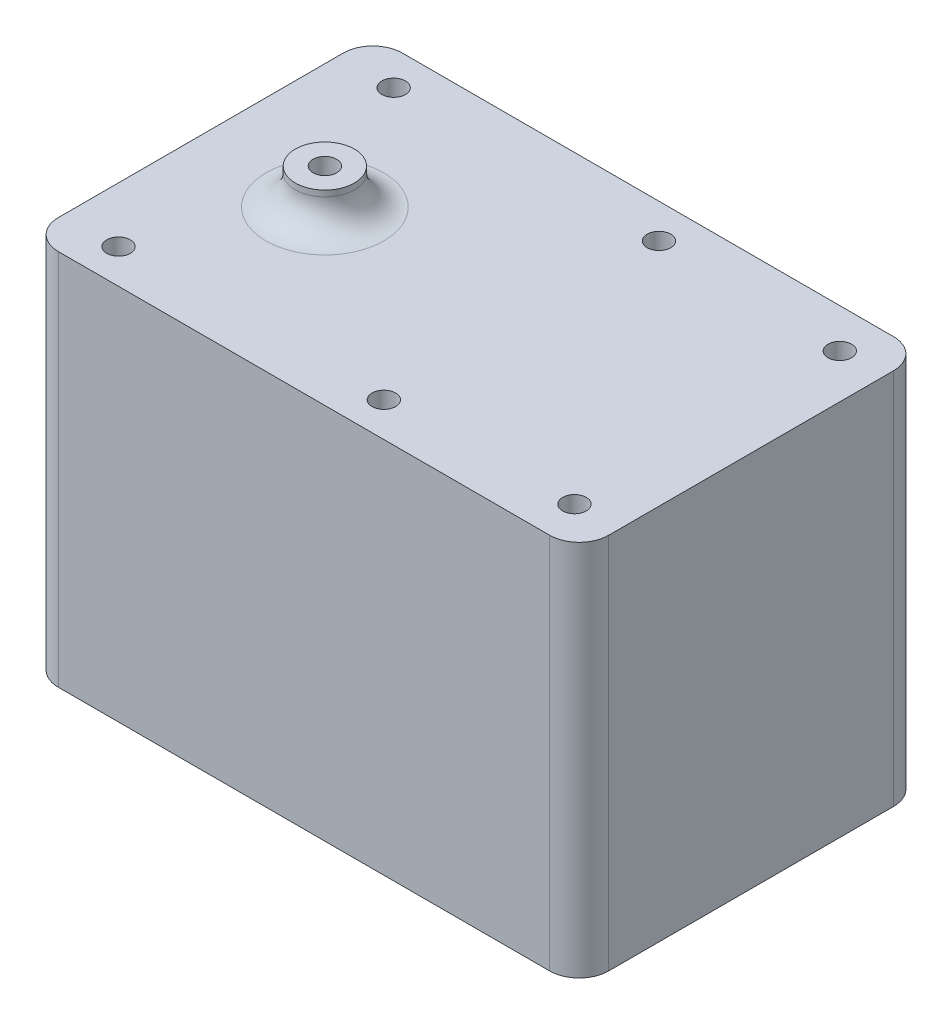
ISO-10303-21;
HEADER;
FILE_DESCRIPTION(('STEP AP214'),'2;1');
FILE_NAME('part.step','',(''),(''),'','','');
FILE_SCHEMA(('AUTOMOTIVE_DESIGN { 1 0 10303 214 1 1 1 1 }'));
ENDSEC;
DATA;
#1=APPLICATION_CONTEXT('core data for automotive mechanical design processes');
#2=APPLICATION_PROTOCOL_DEFINITION('international standard','automotive_design',2000,#1);
#3=PRODUCT_CONTEXT('',#1,'mechanical');
#4=PRODUCT('Part','Part','',(#3));
#5=PRODUCT_RELATED_PRODUCT_CATEGORY('part','',(#4));
#6=PRODUCT_DEFINITION_FORMATION('','',#4);
#7=PRODUCT_DEFINITION_CONTEXT('part definition',#1,'design');
#8=PRODUCT_DEFINITION('design','',#6,#7);
#9=PRODUCT_DEFINITION_SHAPE('','',#8);
#10=(LENGTH_UNIT() NAMED_UNIT(*) SI_UNIT(.MILLI.,.METRE.));
#11=(NAMED_UNIT(*) PLANE_ANGLE_UNIT() SI_UNIT($,.RADIAN.));
#12=(NAMED_UNIT(*) SI_UNIT($,.STERADIAN.) SOLID_ANGLE_UNIT());
#13=UNCERTAINTY_MEASURE_WITH_UNIT(LENGTH_MEASURE(1.E-05),#10,'distance_accuracy_value','');
#14=(GEOMETRIC_REPRESENTATION_CONTEXT(3) GLOBAL_UNCERTAINTY_ASSIGNED_CONTEXT((#13)) GLOBAL_UNIT_ASSIGNED_CONTEXT((#10,
#11,#12)) REPRESENTATION_CONTEXT('',''));
#15=CARTESIAN_POINT('',(0.,0.,0.));
#16=DIRECTION('',(0.,0.,1.));
#17=DIRECTION('',(1.,0.,0.));
#18=AXIS2_PLACEMENT_3D('',#15,#16,#17);
#19=CARTESIAN_POINT('',(0.,38.4,0.));
#20=DIRECTION('',(0.,1.,0.));
#21=DIRECTION('',(0.,0.,1.));
#22=AXIS2_PLACEMENT_3D('',#19,#20,#21);
#23=PLANE('',#22);
#24=CARTESIAN_POINT('',(-15.38,38.4,0.));
#25=DIRECTION('',(0.,1.,0.));
#26=DIRECTION('',(0.,0.,1.));
#27=AXIS2_PLACEMENT_3D('',#24,#25,#26);
#28=CIRCLE('',#27,6.);
#29=CARTESIAN_POINT('',(-15.38,38.4,6.));
#30=VERTEX_POINT('',#29);
#31=EDGE_CURVE('E153',#30,#30,#28,.F.);
#32=ORIENTED_EDGE('',*,*,#31,.T.);
#33=EDGE_LOOP('',(#32));
#34=FACE_BOUND('',#33,.T.);
#35=CARTESIAN_POINT('',(23.52,38.4,-13.5));
#36=DIRECTION('',(0.,1.,0.));
#37=DIRECTION('',(0.,0.,1.));
#38=AXIS2_PLACEMENT_3D('',#35,#36,#37);
#39=CIRCLE('',#38,1.2);
#40=CARTESIAN_POINT('',(23.52,38.4,-12.3));
#41=VERTEX_POINT('',#40);
#42=EDGE_CURVE('E243',#41,#41,#39,.T.);
#43=ORIENTED_EDGE('',*,*,#42,.F.);
#44=EDGE_LOOP('',(#43));
#45=FACE_BOUND('',#44,.T.);
#46=CARTESIAN_POINT('',(-22.38,38.4,14.));
#47=DIRECTION('',(0.,1.,0.));
#48=DIRECTION('',(0.,0.,1.));
#49=AXIS2_PLACEMENT_3D('',#46,#47,#48);
#50=CIRCLE('',#49,1.2);
#51=CARTESIAN_POINT('',(-22.38,38.4,15.2));
#52=VERTEX_POINT('',#51);
#53=EDGE_CURVE('E255',#52,#52,#50,.T.);
#54=ORIENTED_EDGE('',*,*,#53,.F.);
#55=EDGE_LOOP('',(#54));
#56=FACE_BOUND('',#55,.T.);
#57=CARTESIAN_POINT('',(-22.38,38.4,-14.));
#58=DIRECTION('',(0.,1.,0.));
#59=DIRECTION('',(0.,0.,1.));
#60=AXIS2_PLACEMENT_3D('',#57,#58,#59);
#61=CIRCLE('',#60,1.2);
#62=CARTESIAN_POINT('',(-22.38,38.4,-12.8));
#63=VERTEX_POINT('',#62);
#64=EDGE_CURVE('E267',#63,#63,#61,.T.);
#65=ORIENTED_EDGE('',*,*,#64,.F.);
#66=EDGE_LOOP('',(#65));
#67=FACE_BOUND('',#66,.T.);
#68=DIRECTION('',(0.,0.,-1.));
#69=VECTOR('',#68,1.);
#70=CARTESIAN_POINT('',(28.,38.4,17.5));
#71=LINE('',#70,#69);
#72=CARTESIAN_POINT('',(28.,38.4,14.5));
#73=VERTEX_POINT('',#72);
#74=CARTESIAN_POINT('',(28.,38.4,-14.5));
#75=VERTEX_POINT('',#74);
#76=EDGE_CURVE('E274',#73,#75,#71,.T.);
#77=ORIENTED_EDGE('',*,*,#76,.T.);
#78=CARTESIAN_POINT('',(25.,38.4,-14.5));
#79=DIRECTION('',(0.,1.,0.));
#80=DIRECTION('',(0.,0.,1.));
#81=AXIS2_PLACEMENT_3D('',#78,#79,#80);
#82=CIRCLE('',#81,3.);
#83=CARTESIAN_POINT('',(25.,38.4,-17.5));
#84=VERTEX_POINT('',#83);
#85=EDGE_CURVE('E161',#75,#84,#82,.T.);
#86=ORIENTED_EDGE('',*,*,#85,.T.);
#87=DIRECTION('',(-1.,0.,0.));
#88=VECTOR('',#87,1.);
#89=CARTESIAN_POINT('',(28.,38.4,-17.5));
#90=LINE('',#89,#88);
#91=CARTESIAN_POINT('',(-25.,38.4,-17.5));
#92=VERTEX_POINT('',#91);
#93=EDGE_CURVE('E126',#84,#92,#90,.T.);
#94=ORIENTED_EDGE('',*,*,#93,.T.);
#95=CARTESIAN_POINT('',(-25.,38.4,-14.5));
#96=DIRECTION('',(0.,1.,0.));
#97=DIRECTION('',(0.,0.,1.));
#98=AXIS2_PLACEMENT_3D('',#95,#96,#97);
#99=CIRCLE('',#98,3.);
#100=CARTESIAN_POINT('',(-28.,38.4,-14.5));
#101=VERTEX_POINT('',#100);
#102=EDGE_CURVE('E157',#92,#101,#99,.T.);
#103=ORIENTED_EDGE('',*,*,#102,.T.);
#104=DIRECTION('',(0.,0.,1.));
#105=VECTOR('',#104,1.);
#106=CARTESIAN_POINT('',(-28.,38.4,17.5));
#107=LINE('',#106,#105);
#108=CARTESIAN_POINT('',(-28.,38.4,14.5));
#109=VERTEX_POINT('',#108);
#110=EDGE_CURVE('E134',#101,#109,#107,.T.);
#111=ORIENTED_EDGE('',*,*,#110,.T.);
#112=CARTESIAN_POINT('',(-25.,38.4,14.5));
#113=DIRECTION('',(0.,1.,0.));
#114=DIRECTION('',(0.,0.,1.));
#115=AXIS2_PLACEMENT_3D('',#112,#113,#114);
#116=CIRCLE('',#115,3.);
#117=CARTESIAN_POINT('',(-25.,38.4,17.5));
#118=VERTEX_POINT('',#117);
#119=EDGE_CURVE('E61',#109,#118,#116,.T.);
#120=ORIENTED_EDGE('',*,*,#119,.T.);
#121=DIRECTION('',(1.,0.,0.));
#122=VECTOR('',#121,1.);
#123=CARTESIAN_POINT('',(28.,38.4,17.5));
#124=LINE('',#123,#122);
#125=CARTESIAN_POINT('',(25.,38.4,17.5));
#126=VERTEX_POINT('',#125);
#127=EDGE_CURVE('E137',#118,#126,#124,.T.);
#128=ORIENTED_EDGE('',*,*,#127,.T.);
#129=CARTESIAN_POINT('',(25.,38.4,14.5));
#130=DIRECTION('',(0.,1.,0.));
#131=DIRECTION('',(0.,0.,1.));
#132=AXIS2_PLACEMENT_3D('',#129,#130,#131);
#133=CIRCLE('',#132,3.);
#134=EDGE_CURVE('E159',#126,#73,#133,.T.);
#135=ORIENTED_EDGE('',*,*,#134,.T.);
#136=EDGE_LOOP('',(#77,#86,#94,#103,#111,#120,#128,#135));
#137=FACE_BOUND('',#136,.T.);
#138=CARTESIAN_POINT('',(4.62,38.4,-14.));
#139=DIRECTION('',(0.,1.,0.));
#140=DIRECTION('',(0.,0.,1.));
#141=AXIS2_PLACEMENT_3D('',#138,#139,#140);
#142=CIRCLE('',#141,1.2);
#143=CARTESIAN_POINT('',(4.62,38.4,-12.8));
#144=VERTEX_POINT('',#143);
#145=EDGE_CURVE('E261',#144,#144,#142,.T.);
#146=ORIENTED_EDGE('',*,*,#145,.F.);
#147=EDGE_LOOP('',(#146));
#148=FACE_BOUND('',#147,.T.);
#149=CARTESIAN_POINT('',(4.62,38.4,14.));
#150=DIRECTION('',(0.,1.,0.));
#151=DIRECTION('',(0.,0.,1.));
#152=AXIS2_PLACEMENT_3D('',#149,#150,#151);
#153=CIRCLE('',#152,1.2);
#154=CARTESIAN_POINT('',(4.62,38.4,15.2));
#155=VERTEX_POINT('',#154);
#156=EDGE_CURVE('E249',#155,#155,#153,.T.);
#157=ORIENTED_EDGE('',*,*,#156,.F.);
#158=EDGE_LOOP('',(#157));
#159=FACE_BOUND('',#158,.T.);
#160=CARTESIAN_POINT('',(23.52,38.4,13.5));
#161=DIRECTION('',(0.,1.,0.));
#162=DIRECTION('',(0.,0.,1.));
#163=AXIS2_PLACEMENT_3D('',#160,#161,#162);
#164=CIRCLE('',#163,1.2);
#165=CARTESIAN_POINT('',(23.52,38.4,14.7));
#166=VERTEX_POINT('',#165);
#167=EDGE_CURVE('E237',#166,#166,#164,.T.);
#168=ORIENTED_EDGE('',*,*,#167,.F.);
#169=EDGE_LOOP('',(#168));
#170=FACE_BOUND('',#169,.T.);
#171=ADVANCED_FACE('F39',(#34,#45,#56,#67,#137,#148,#159,#170),#23,.T.);
#172=CARTESIAN_POINT('',(0.,0.,0.));
#173=DIRECTION('',(0.,1.,0.));
#174=DIRECTION('',(0.,0.,1.));
#175=AXIS2_PLACEMENT_3D('',#172,#173,#174);
#176=PLANE('',#175);
#177=CARTESIAN_POINT('',(-15.38,0.,0.));
#178=DIRECTION('',(0.,1.,0.));
#179=DIRECTION('',(0.,0.,1.));
#180=AXIS2_PLACEMENT_3D('',#177,#178,#179);
#181=CIRCLE('',#180,6.);
#182=CARTESIAN_POINT('',(-15.38,0.,6.));
#183=VERTEX_POINT('',#182);
#184=EDGE_CURVE('E127',#183,#183,#181,.T.);
#185=ORIENTED_EDGE('',*,*,#184,.T.);
#186=EDGE_LOOP('',(#185));
#187=FACE_BOUND('',#186,.T.);
#188=DIRECTION('',(-1.,0.,0.));
#189=VECTOR('',#188,1.);
#190=CARTESIAN_POINT('',(28.,0.,-17.5));
#191=LINE('',#190,#189);
#192=CARTESIAN_POINT('',(25.,0.,-17.5));
#193=VERTEX_POINT('',#192);
#194=CARTESIAN_POINT('',(-25.,0.,-17.5));
#195=VERTEX_POINT('',#194);
#196=EDGE_CURVE('E123',#193,#195,#191,.T.);
#197=ORIENTED_EDGE('',*,*,#196,.F.);
#198=CARTESIAN_POINT('',(25.,0.,-14.5));
#199=DIRECTION('',(0.,1.,0.));
#200=DIRECTION('',(0.,0.,1.));
#201=AXIS2_PLACEMENT_3D('',#198,#199,#200);
#202=CIRCLE('',#201,3.);
#203=CARTESIAN_POINT('',(28.,0.,-14.5));
#204=VERTEX_POINT('',#203);
#205=EDGE_CURVE('E106',#193,#204,#202,.F.);
#206=ORIENTED_EDGE('',*,*,#205,.T.);
#207=DIRECTION('',(0.,0.,-1.));
#208=VECTOR('',#207,1.);
#209=CARTESIAN_POINT('',(28.,0.,17.5));
#210=LINE('',#209,#208);
#211=CARTESIAN_POINT('',(28.,0.,14.5));
#212=VERTEX_POINT('',#211);
#213=EDGE_CURVE('E135',#212,#204,#210,.T.);
#214=ORIENTED_EDGE('',*,*,#213,.F.);
#215=CARTESIAN_POINT('',(25.,0.,14.5));
#216=DIRECTION('',(0.,1.,0.));
#217=DIRECTION('',(0.,0.,1.));
#218=AXIS2_PLACEMENT_3D('',#215,#216,#217);
#219=CIRCLE('',#218,3.);
#220=CARTESIAN_POINT('',(25.,0.,17.5));
#221=VERTEX_POINT('',#220);
#222=EDGE_CURVE('E117',#212,#221,#219,.F.);
#223=ORIENTED_EDGE('',*,*,#222,.T.);
#224=DIRECTION('',(1.,0.,0.));
#225=VECTOR('',#224,1.);
#226=CARTESIAN_POINT('',(28.,0.,17.5));
#227=LINE('',#226,#225);
#228=CARTESIAN_POINT('',(-25.,0.,17.5));
#229=VERTEX_POINT('',#228);
#230=EDGE_CURVE('E139',#229,#221,#227,.T.);
#231=ORIENTED_EDGE('',*,*,#230,.F.);
#232=CARTESIAN_POINT('',(-25.,0.,14.5));
#233=DIRECTION('',(0.,1.,0.));
#234=DIRECTION('',(0.,0.,1.));
#235=AXIS2_PLACEMENT_3D('',#232,#233,#234);
#236=CIRCLE('',#235,3.);
#237=CARTESIAN_POINT('',(-28.,0.,14.5));
#238=VERTEX_POINT('',#237);
#239=EDGE_CURVE('E146',#229,#238,#236,.F.);
#240=ORIENTED_EDGE('',*,*,#239,.T.);
#241=DIRECTION('',(0.,0.,1.));
#242=VECTOR('',#241,1.);
#243=CARTESIAN_POINT('',(-28.,0.,17.5));
#244=LINE('',#243,#242);
#245=CARTESIAN_POINT('',(-28.,0.,-14.5));
#246=VERTEX_POINT('',#245);
#247=EDGE_CURVE('E270',#246,#238,#244,.T.);
#248=ORIENTED_EDGE('',*,*,#247,.F.);
#249=CARTESIAN_POINT('',(-25.,0.,-14.5));
#250=DIRECTION('',(0.,1.,0.));
#251=DIRECTION('',(0.,0.,1.));
#252=AXIS2_PLACEMENT_3D('',#249,#250,#251);
#253=CIRCLE('',#252,3.);
#254=EDGE_CURVE('E133',#246,#195,#253,.F.);
#255=ORIENTED_EDGE('',*,*,#254,.T.);
#256=EDGE_LOOP('',(#197,#206,#214,#223,#231,#240,#248,#255));
#257=FACE_BOUND('',#256,.T.);
#258=CARTESIAN_POINT('',(-22.38,0.,-14.));
#259=DIRECTION('',(0.,1.,0.));
#260=DIRECTION('',(0.,0.,1.));
#261=AXIS2_PLACEMENT_3D('',#258,#259,#260);
#262=CIRCLE('',#261,1.2);
#263=CARTESIAN_POINT('',(-22.38,0.,-12.8));
#264=VERTEX_POINT('',#263);
#265=EDGE_CURVE('E264',#264,#264,#262,.T.);
#266=ORIENTED_EDGE('',*,*,#265,.T.);
#267=EDGE_LOOP('',(#266));
#268=FACE_BOUND('',#267,.T.);
#269=CARTESIAN_POINT('',(4.62,0.,-14.));
#270=DIRECTION('',(0.,1.,0.));
#271=DIRECTION('',(0.,0.,1.));
#272=AXIS2_PLACEMENT_3D('',#269,#270,#271);
#273=CIRCLE('',#272,1.2);
#274=CARTESIAN_POINT('',(4.62,0.,-12.8));
#275=VERTEX_POINT('',#274);
#276=EDGE_CURVE('E258',#275,#275,#273,.T.);
#277=ORIENTED_EDGE('',*,*,#276,.T.);
#278=EDGE_LOOP('',(#277));
#279=FACE_BOUND('',#278,.T.);
#280=CARTESIAN_POINT('',(-22.38,0.,14.));
#281=DIRECTION('',(0.,1.,0.));
#282=DIRECTION('',(0.,0.,1.));
#283=AXIS2_PLACEMENT_3D('',#280,#281,#282);
#284=CIRCLE('',#283,1.2);
#285=CARTESIAN_POINT('',(-22.38,0.,15.2));
#286=VERTEX_POINT('',#285);
#287=EDGE_CURVE('E252',#286,#286,#284,.T.);
#288=ORIENTED_EDGE('',*,*,#287,.T.);
#289=EDGE_LOOP('',(#288));
#290=FACE_BOUND('',#289,.T.);
#291=CARTESIAN_POINT('',(4.62,0.,14.));
#292=DIRECTION('',(0.,1.,0.));
#293=DIRECTION('',(0.,0.,1.));
#294=AXIS2_PLACEMENT_3D('',#291,#292,#293);
#295=CIRCLE('',#294,1.2);
#296=CARTESIAN_POINT('',(4.62,0.,15.2));
#297=VERTEX_POINT('',#296);
#298=EDGE_CURVE('E246',#297,#297,#295,.T.);
#299=ORIENTED_EDGE('',*,*,#298,.T.);
#300=EDGE_LOOP('',(#299));
#301=FACE_BOUND('',#300,.T.);
#302=CARTESIAN_POINT('',(23.52,0.,-13.5));
#303=DIRECTION('',(0.,1.,0.));
#304=DIRECTION('',(0.,0.,1.));
#305=AXIS2_PLACEMENT_3D('',#302,#303,#304);
#306=CIRCLE('',#305,1.2);
#307=CARTESIAN_POINT('',(23.52,0.,-12.3));
#308=VERTEX_POINT('',#307);
#309=EDGE_CURVE('E240',#308,#308,#306,.T.);
#310=ORIENTED_EDGE('',*,*,#309,.T.);
#311=EDGE_LOOP('',(#310));
#312=FACE_BOUND('',#311,.T.);
#313=CARTESIAN_POINT('',(23.52,0.,13.5));
#314=DIRECTION('',(0.,1.,0.));
#315=DIRECTION('',(0.,0.,1.));
#316=AXIS2_PLACEMENT_3D('',#313,#314,#315);
#317=CIRCLE('',#316,1.2);
#318=CARTESIAN_POINT('',(23.52,0.,14.7));
#319=VERTEX_POINT('',#318);
#320=EDGE_CURVE('E236',#319,#319,#317,.T.);
#321=ORIENTED_EDGE('',*,*,#320,.T.);
#322=EDGE_LOOP('',(#321));
#323=FACE_BOUND('',#322,.T.);
#324=ADVANCED_FACE('F130',(#187,#257,#268,#279,#290,#301,#312,#323),#176,.F.);
#325=CARTESIAN_POINT('',(-28.,38.4,17.5));
#326=DIRECTION('',(1.,0.,0.));
#327=DIRECTION('',(0.,0.,-1.));
#328=AXIS2_PLACEMENT_3D('',#325,#326,#327);
#329=PLANE('',#328);
#330=ORIENTED_EDGE('',*,*,#110,.F.);
#331=DIRECTION('',(0.,-1.,0.));
#332=VECTOR('',#331,1.);
#333=CARTESIAN_POINT('',(-28.,38.4,-14.5));
#334=LINE('',#333,#332);
#335=EDGE_CURVE('E169',#101,#246,#334,.T.);
#336=ORIENTED_EDGE('',*,*,#335,.T.);
#337=ORIENTED_EDGE('',*,*,#247,.T.);
#338=DIRECTION('',(0.,-1.,0.));
#339=VECTOR('',#338,1.);
#340=CARTESIAN_POINT('',(-28.,38.4,14.5));
#341=LINE('',#340,#339);
#342=EDGE_CURVE('E167',#238,#109,#341,.F.);
#343=ORIENTED_EDGE('',*,*,#342,.T.);
#344=EDGE_LOOP('',(#330,#336,#337,#343));
#345=FACE_BOUND('',#344,.T.);
#346=ADVANCED_FACE('F197',(#345),#329,.F.);
#347=CARTESIAN_POINT('',(28.,38.4,17.5));
#348=DIRECTION('',(0.,0.,-1.));
#349=DIRECTION('',(-1.,0.,0.));
#350=AXIS2_PLACEMENT_3D('',#347,#348,#349);
#351=PLANE('',#350);
#352=ORIENTED_EDGE('',*,*,#230,.T.);
#353=DIRECTION('',(0.,-1.,0.));
#354=VECTOR('',#353,1.);
#355=CARTESIAN_POINT('',(25.,38.4,17.5));
#356=LINE('',#355,#354);
#357=EDGE_CURVE('E54',#221,#126,#356,.F.);
#358=ORIENTED_EDGE('',*,*,#357,.T.);
#359=ORIENTED_EDGE('',*,*,#127,.F.);
#360=DIRECTION('',(0.,-1.,0.));
#361=VECTOR('',#360,1.);
#362=CARTESIAN_POINT('',(-25.,38.4,17.5));
#363=LINE('',#362,#361);
#364=EDGE_CURVE('E163',#118,#229,#363,.T.);
#365=ORIENTED_EDGE('',*,*,#364,.T.);
#366=EDGE_LOOP('',(#352,#358,#359,#365));
#367=FACE_BOUND('',#366,.T.);
#368=ADVANCED_FACE('F280',(#367),#351,.F.);
#369=CARTESIAN_POINT('',(28.,38.4,17.5));
#370=DIRECTION('',(-1.,0.,0.));
#371=DIRECTION('',(0.,0.,1.));
#372=AXIS2_PLACEMENT_3D('',#369,#370,#371);
#373=PLANE('',#372);
#374=ORIENTED_EDGE('',*,*,#213,.T.);
#375=DIRECTION('',(0.,-1.,0.));
#376=VECTOR('',#375,1.);
#377=CARTESIAN_POINT('',(28.,38.4,-14.5));
#378=LINE('',#377,#376);
#379=EDGE_CURVE('E111',#204,#75,#378,.F.);
#380=ORIENTED_EDGE('',*,*,#379,.T.);
#381=ORIENTED_EDGE('',*,*,#76,.F.);
#382=DIRECTION('',(0.,-1.,0.));
#383=VECTOR('',#382,1.);
#384=CARTESIAN_POINT('',(28.,38.4,14.5));
#385=LINE('',#384,#383);
#386=EDGE_CURVE('E116',#73,#212,#385,.T.);
#387=ORIENTED_EDGE('',*,*,#386,.T.);
#388=EDGE_LOOP('',(#374,#380,#381,#387));
#389=FACE_BOUND('',#388,.T.);
#390=ADVANCED_FACE('F288',(#389),#373,.F.);
#391=CARTESIAN_POINT('',(28.,38.4,-17.5));
#392=DIRECTION('',(0.,0.,1.));
#393=DIRECTION('',(1.,0.,0.));
#394=AXIS2_PLACEMENT_3D('',#391,#392,#393);
#395=PLANE('',#394);
#396=ORIENTED_EDGE('',*,*,#93,.F.);
#397=DIRECTION('',(0.,-1.,0.));
#398=VECTOR('',#397,1.);
#399=CARTESIAN_POINT('',(25.,38.4,-17.5));
#400=LINE('',#399,#398);
#401=EDGE_CURVE('E110',#84,#193,#400,.T.);
#402=ORIENTED_EDGE('',*,*,#401,.T.);
#403=ORIENTED_EDGE('',*,*,#196,.T.);
#404=DIRECTION('',(0.,-1.,0.));
#405=VECTOR('',#404,1.);
#406=CARTESIAN_POINT('',(-25.,38.4,-17.5));
#407=LINE('',#406,#405);
#408=EDGE_CURVE('E128',#195,#92,#407,.F.);
#409=ORIENTED_EDGE('',*,*,#408,.T.);
#410=EDGE_LOOP('',(#396,#402,#403,#409));
#411=FACE_BOUND('',#410,.T.);
#412=ADVANCED_FACE('F122',(#411),#395,.F.);
#413=CARTESIAN_POINT('',(-22.38,38.4,-14.));
#414=DIRECTION('',(0.,-1.,0.));
#415=DIRECTION('',(0.,0.,-1.));
#416=AXIS2_PLACEMENT_3D('',#413,#414,#415);
#417=CYLINDRICAL_SURFACE('',#416,1.2);
#418=ORIENTED_EDGE('',*,*,#64,.T.);
#419=EDGE_LOOP('',(#418));
#420=FACE_BOUND('',#419,.T.);
#421=ORIENTED_EDGE('',*,*,#265,.F.);
#422=EDGE_LOOP('',(#421));
#423=FACE_BOUND('',#422,.T.);
#424=ADVANCED_FACE('F295',(#420,#423),#417,.F.);
#425=CARTESIAN_POINT('',(4.62,38.4,-14.));
#426=DIRECTION('',(0.,-1.,0.));
#427=DIRECTION('',(0.,0.,-1.));
#428=AXIS2_PLACEMENT_3D('',#425,#426,#427);
#429=CYLINDRICAL_SURFACE('',#428,1.2);
#430=ORIENTED_EDGE('',*,*,#145,.T.);
#431=EDGE_LOOP('',(#430));
#432=FACE_BOUND('',#431,.T.);
#433=ORIENTED_EDGE('',*,*,#276,.F.);
#434=EDGE_LOOP('',(#433));
#435=FACE_BOUND('',#434,.T.);
#436=ADVANCED_FACE('F457',(#432,#435),#429,.F.);
#437=CARTESIAN_POINT('',(-22.38,38.4,14.));
#438=DIRECTION('',(0.,-1.,0.));
#439=DIRECTION('',(0.,0.,-1.));
#440=AXIS2_PLACEMENT_3D('',#437,#438,#439);
#441=CYLINDRICAL_SURFACE('',#440,1.2);
#442=ORIENTED_EDGE('',*,*,#53,.T.);
#443=EDGE_LOOP('',(#442));
#444=FACE_BOUND('',#443,.T.);
#445=ORIENTED_EDGE('',*,*,#287,.F.);
#446=EDGE_LOOP('',(#445));
#447=FACE_BOUND('',#446,.T.);
#448=ADVANCED_FACE('F447',(#444,#447),#441,.F.);
#449=CARTESIAN_POINT('',(4.62,38.4,14.));
#450=DIRECTION('',(0.,-1.,0.));
#451=DIRECTION('',(0.,0.,-1.));
#452=AXIS2_PLACEMENT_3D('',#449,#450,#451);
#453=CYLINDRICAL_SURFACE('',#452,1.2);
#454=ORIENTED_EDGE('',*,*,#156,.T.);
#455=EDGE_LOOP('',(#454));
#456=FACE_BOUND('',#455,.T.);
#457=ORIENTED_EDGE('',*,*,#298,.F.);
#458=EDGE_LOOP('',(#457));
#459=FACE_BOUND('',#458,.T.);
#460=ADVANCED_FACE('F437',(#456,#459),#453,.F.);
#461=CARTESIAN_POINT('',(23.52,38.4,-13.5));
#462=DIRECTION('',(0.,-1.,0.));
#463=DIRECTION('',(0.,0.,-1.));
#464=AXIS2_PLACEMENT_3D('',#461,#462,#463);
#465=CYLINDRICAL_SURFACE('',#464,1.2);
#466=ORIENTED_EDGE('',*,*,#42,.T.);
#467=EDGE_LOOP('',(#466));
#468=FACE_BOUND('',#467,.T.);
#469=ORIENTED_EDGE('',*,*,#309,.F.);
#470=EDGE_LOOP('',(#469));
#471=FACE_BOUND('',#470,.T.);
#472=ADVANCED_FACE('F427',(#468,#471),#465,.F.);
#473=CARTESIAN_POINT('',(23.52,38.4,13.5));
#474=DIRECTION('',(0.,-1.,0.));
#475=DIRECTION('',(0.,0.,-1.));
#476=AXIS2_PLACEMENT_3D('',#473,#474,#475);
#477=CYLINDRICAL_SURFACE('',#476,1.2);
#478=ORIENTED_EDGE('',*,*,#167,.T.);
#479=EDGE_LOOP('',(#478));
#480=FACE_BOUND('',#479,.T.);
#481=ORIENTED_EDGE('',*,*,#320,.F.);
#482=EDGE_LOOP('',(#481));
#483=FACE_BOUND('',#482,.T.);
#484=ADVANCED_FACE('F408',(#480,#483),#477,.F.);
#485=CARTESIAN_POINT('',(-15.38,-3.6,0.));
#486=DIRECTION('',(0.,-1.,0.));
#487=DIRECTION('',(0.,0.,-1.));
#488=AXIS2_PLACEMENT_3D('',#485,#486,#487);
#489=PLANE('',#488);
#490=CARTESIAN_POINT('',(-15.38,-3.6,0.));
#491=DIRECTION('',(0.,-1.,0.));
#492=DIRECTION('',(0.,0.,-1.));
#493=AXIS2_PLACEMENT_3D('',#490,#491,#492);
#494=CIRCLE('',#493,3.);
#495=CARTESIAN_POINT('',(-15.38,-3.6,-3.));
#496=VERTEX_POINT('',#495);
#497=EDGE_CURVE('E231',#496,#496,#494,.T.);
#498=ORIENTED_EDGE('',*,*,#497,.T.);
#499=EDGE_LOOP('',(#498));
#500=FACE_BOUND('',#499,.T.);
#501=CARTESIAN_POINT('',(-15.38,-3.6,0.));
#502=DIRECTION('',(0.,-1.,0.));
#503=DIRECTION('',(0.,0.,-1.));
#504=AXIS2_PLACEMENT_3D('',#501,#502,#503);
#505=CIRCLE('',#504,1.2);
#506=CARTESIAN_POINT('',(-15.38,-3.6,-1.2));
#507=VERTEX_POINT('',#506);
#508=EDGE_CURVE('E228',#507,#507,#505,.T.);
#509=ORIENTED_EDGE('',*,*,#508,.F.);
#510=EDGE_LOOP('',(#509));
#511=FACE_BOUND('',#510,.T.);
#512=ADVANCED_FACE('F399',(#500,#511),#489,.T.);
#513=CARTESIAN_POINT('',(-15.38,-3.6,0.));
#514=DIRECTION('',(0.,1.,0.));
#515=DIRECTION('',(0.,0.,1.));
#516=AXIS2_PLACEMENT_3D('',#513,#514,#515);
#517=CYLINDRICAL_SURFACE('',#516,3.);
#518=CARTESIAN_POINT('',(-15.38,-3.,0.));
#519=DIRECTION('',(0.,1.,0.));
#520=DIRECTION('',(0.,0.,1.));
#521=AXIS2_PLACEMENT_3D('',#518,#519,#520);
#522=CIRCLE('',#521,3.);
#523=CARTESIAN_POINT('',(-15.38,-3.,3.));
#524=VERTEX_POINT('',#523);
#525=EDGE_CURVE('E47',#524,#524,#522,.F.);
#526=ORIENTED_EDGE('',*,*,#525,.T.);
#527=EDGE_LOOP('',(#526));
#528=FACE_BOUND('',#527,.T.);
#529=ORIENTED_EDGE('',*,*,#497,.F.);
#530=EDGE_LOOP('',(#529));
#531=FACE_BOUND('',#530,.T.);
#532=ADVANCED_FACE('F174',(#528,#531),#517,.T.);
#533=CARTESIAN_POINT('',(-15.38,-3.6,0.));
#534=DIRECTION('',(0.,1.,0.));
#535=DIRECTION('',(0.,0.,1.));
#536=AXIS2_PLACEMENT_3D('',#533,#534,#535);
#537=CYLINDRICAL_SURFACE('',#536,1.2);
#538=ORIENTED_EDGE('',*,*,#508,.T.);
#539=EDGE_LOOP('',(#538));
#540=FACE_BOUND('',#539,.T.);
#541=CARTESIAN_POINT('',(-15.38,0.,0.));
#542=DIRECTION('',(0.,-1.,0.));
#543=DIRECTION('',(0.,0.,-1.));
#544=AXIS2_PLACEMENT_3D('',#541,#542,#543);
#545=CIRCLE('',#544,1.2);
#546=CARTESIAN_POINT('',(-15.38,0.,-1.2));
#547=VERTEX_POINT('',#546);
#548=EDGE_CURVE('E227',#547,#547,#545,.T.);
#549=ORIENTED_EDGE('',*,*,#548,.F.);
#550=EDGE_LOOP('',(#549));
#551=FACE_BOUND('',#550,.T.);
#552=ADVANCED_FACE('F386',(#540,#551),#537,.F.);
#553=ORIENTED_EDGE('',*,*,#548,.T.);
#554=EDGE_LOOP('',(#553));
#555=FACE_BOUND('',#554,.T.);
#556=ADVANCED_FACE('F200',(#555),#176,.F.);
#557=CARTESIAN_POINT('',(-15.38,42.,0.));
#558=DIRECTION('',(0.,-1.,0.));
#559=DIRECTION('',(0.,0.,-1.));
#560=AXIS2_PLACEMENT_3D('',#557,#558,#559);
#561=CYLINDRICAL_SURFACE('',#560,3.);
#562=CARTESIAN_POINT('',(-15.38,41.4,0.));
#563=DIRECTION('',(0.,1.,0.));
#564=DIRECTION('',(0.,0.,1.));
#565=AXIS2_PLACEMENT_3D('',#562,#563,#564);
#566=CIRCLE('',#565,3.);
#567=CARTESIAN_POINT('',(-15.38,41.4,3.));
#568=VERTEX_POINT('',#567);
#569=EDGE_CURVE('E11',#568,#568,#566,.T.);
#570=ORIENTED_EDGE('',*,*,#569,.T.);
#571=EDGE_LOOP('',(#570));
#572=FACE_BOUND('',#571,.T.);
#573=CARTESIAN_POINT('',(-15.38,42.,0.));
#574=DIRECTION('',(0.,-1.,0.));
#575=DIRECTION('',(0.,0.,-1.));
#576=AXIS2_PLACEMENT_3D('',#573,#574,#575);
#577=CIRCLE('',#576,3.);
#578=CARTESIAN_POINT('',(-15.38,42.,-3.));
#579=VERTEX_POINT('',#578);
#580=EDGE_CURVE('E222',#579,#579,#577,.T.);
#581=ORIENTED_EDGE('',*,*,#580,.T.);
#582=EDGE_LOOP('',(#581));
#583=FACE_BOUND('',#582,.T.);
#584=ADVANCED_FACE('F364',(#572,#583),#561,.T.);
#585=CARTESIAN_POINT('',(-15.38,42.,0.));
#586=DIRECTION('',(0.,1.,0.));
#587=DIRECTION('',(0.,0.,-1.));
#588=AXIS2_PLACEMENT_3D('',#585,#586,#587);
#589=PLANE('',#588);
#590=CARTESIAN_POINT('',(-15.38,42.,0.));
#591=DIRECTION('',(0.,-1.,0.));
#592=DIRECTION('',(0.,0.,-1.));
#593=AXIS2_PLACEMENT_3D('',#590,#591,#592);
#594=CIRCLE('',#593,1.2);
#595=CARTESIAN_POINT('',(-15.38,42.,-1.2));
#596=VERTEX_POINT('',#595);
#597=EDGE_CURVE('E219',#596,#596,#594,.T.);
#598=ORIENTED_EDGE('',*,*,#597,.T.);
#599=EDGE_LOOP('',(#598));
#600=FACE_BOUND('',#599,.T.);
#601=ORIENTED_EDGE('',*,*,#580,.F.);
#602=EDGE_LOOP('',(#601));
#603=FACE_BOUND('',#602,.T.);
#604=ADVANCED_FACE('F212',(#600,#603),#589,.T.);
#605=CARTESIAN_POINT('',(-15.38,42.,0.));
#606=DIRECTION('',(0.,-1.,0.));
#607=DIRECTION('',(0.,0.,-1.));
#608=AXIS2_PLACEMENT_3D('',#605,#606,#607);
#609=CYLINDRICAL_SURFACE('',#608,1.2);
#610=ORIENTED_EDGE('',*,*,#597,.F.);
#611=EDGE_LOOP('',(#610));
#612=FACE_BOUND('',#611,.T.);
#613=CARTESIAN_POINT('',(-15.38,38.4,0.));
#614=DIRECTION('',(0.,-1.,0.));
#615=DIRECTION('',(0.,0.,-1.));
#616=AXIS2_PLACEMENT_3D('',#613,#614,#615);
#617=CIRCLE('',#616,1.2);
#618=CARTESIAN_POINT('',(-15.38,38.4,-1.2));
#619=VERTEX_POINT('',#618);
#620=EDGE_CURVE('E217',#619,#619,#617,.T.);
#621=ORIENTED_EDGE('',*,*,#620,.T.);
#622=EDGE_LOOP('',(#621));
#623=FACE_BOUND('',#622,.T.);
#624=ADVANCED_FACE('F204',(#612,#623),#609,.F.);
#625=ORIENTED_EDGE('',*,*,#620,.F.);
#626=EDGE_LOOP('',(#625));
#627=FACE_BOUND('',#626,.T.);
#628=ADVANCED_FACE('F193',(#627),#23,.T.);
#629=CARTESIAN_POINT('',(25.,38.4,-14.5));
#630=DIRECTION('',(0.,-1.,0.));
#631=DIRECTION('',(0.,0.,-1.));
#632=AXIS2_PLACEMENT_3D('',#629,#630,#631);
#633=CYLINDRICAL_SURFACE('',#632,3.);
#634=ORIENTED_EDGE('',*,*,#85,.F.);
#635=ORIENTED_EDGE('',*,*,#379,.F.);
#636=ORIENTED_EDGE('',*,*,#205,.F.);
#637=ORIENTED_EDGE('',*,*,#401,.F.);
#638=EDGE_LOOP('',(#634,#635,#636,#637));
#639=FACE_BOUND('',#638,.T.);
#640=ADVANCED_FACE('F109',(#639),#633,.T.);
#641=CARTESIAN_POINT('',(25.,38.4,14.5));
#642=DIRECTION('',(0.,-1.,0.));
#643=DIRECTION('',(0.,0.,-1.));
#644=AXIS2_PLACEMENT_3D('',#641,#642,#643);
#645=CYLINDRICAL_SURFACE('',#644,3.);
#646=ORIENTED_EDGE('',*,*,#134,.F.);
#647=ORIENTED_EDGE('',*,*,#357,.F.);
#648=ORIENTED_EDGE('',*,*,#222,.F.);
#649=ORIENTED_EDGE('',*,*,#386,.F.);
#650=EDGE_LOOP('',(#646,#647,#648,#649));
#651=FACE_BOUND('',#650,.T.);
#652=ADVANCED_FACE('F210',(#651),#645,.T.);
#653=CARTESIAN_POINT('',(-25.,38.4,-14.5));
#654=DIRECTION('',(0.,-1.,0.));
#655=DIRECTION('',(0.,0.,-1.));
#656=AXIS2_PLACEMENT_3D('',#653,#654,#655);
#657=CYLINDRICAL_SURFACE('',#656,3.);
#658=ORIENTED_EDGE('',*,*,#102,.F.);
#659=ORIENTED_EDGE('',*,*,#408,.F.);
#660=ORIENTED_EDGE('',*,*,#254,.F.);
#661=ORIENTED_EDGE('',*,*,#335,.F.);
#662=EDGE_LOOP('',(#658,#659,#660,#661));
#663=FACE_BOUND('',#662,.T.);
#664=ADVANCED_FACE('F186',(#663),#657,.T.);
#665=CARTESIAN_POINT('',(-25.,38.4,14.5));
#666=DIRECTION('',(0.,-1.,0.));
#667=DIRECTION('',(0.,0.,-1.));
#668=AXIS2_PLACEMENT_3D('',#665,#666,#667);
#669=CYLINDRICAL_SURFACE('',#668,3.);
#670=ORIENTED_EDGE('',*,*,#119,.F.);
#671=ORIENTED_EDGE('',*,*,#342,.F.);
#672=ORIENTED_EDGE('',*,*,#239,.F.);
#673=ORIENTED_EDGE('',*,*,#364,.F.);
#674=EDGE_LOOP('',(#670,#671,#672,#673));
#675=FACE_BOUND('',#674,.T.);
#676=ADVANCED_FACE('F179',(#675),#669,.T.);
#677=CARTESIAN_POINT('',(-15.38,-3.,0.));
#678=DIRECTION('',(0.,1.,0.));
#679=DIRECTION('',(0.,0.,1.));
#680=AXIS2_PLACEMENT_3D('',#677,#678,#679);
#681=TOROIDAL_SURFACE('',#680,6.,3.);
#682=ORIENTED_EDGE('',*,*,#184,.F.);
#683=EDGE_LOOP('',(#682));
#684=FACE_BOUND('',#683,.T.);
#685=ORIENTED_EDGE('',*,*,#525,.F.);
#686=EDGE_LOOP('',(#685));
#687=FACE_BOUND('',#686,.T.);
#688=ADVANCED_FACE('F177',(#684,#687),#681,.F.);
#689=CARTESIAN_POINT('',(-15.38,41.4,0.));
#690=DIRECTION('',(0.,1.,0.));
#691=DIRECTION('',(0.,0.,1.));
#692=AXIS2_PLACEMENT_3D('',#689,#690,#691);
#693=TOROIDAL_SURFACE('',#692,6.,3.);
#694=ORIENTED_EDGE('',*,*,#31,.F.);
#695=EDGE_LOOP('',(#694));
#696=FACE_BOUND('',#695,.T.);
#697=ORIENTED_EDGE('',*,*,#569,.F.);
#698=EDGE_LOOP('',(#697));
#699=FACE_BOUND('',#698,.T.);
#700=ADVANCED_FACE('F41',(#696,#699),#693,.F.);
#701=CLOSED_SHELL('',(#171,#324,#346,#368,#390,#412,#424,#436,#448,#460,#472,#484,#512,#532,
#552,#556,#584,#604,#624,#628,#640,#652,#664,#676,#688,#700));
#702=MANIFOLD_SOLID_BREP('B2',#701);
#703=ADVANCED_BREP_SHAPE_REPRESENTATION('',(#18,#702),#14);
#704=SHAPE_DEFINITION_REPRESENTATION(#9,#703);
ENDSEC;
END-ISO-10303-21;
